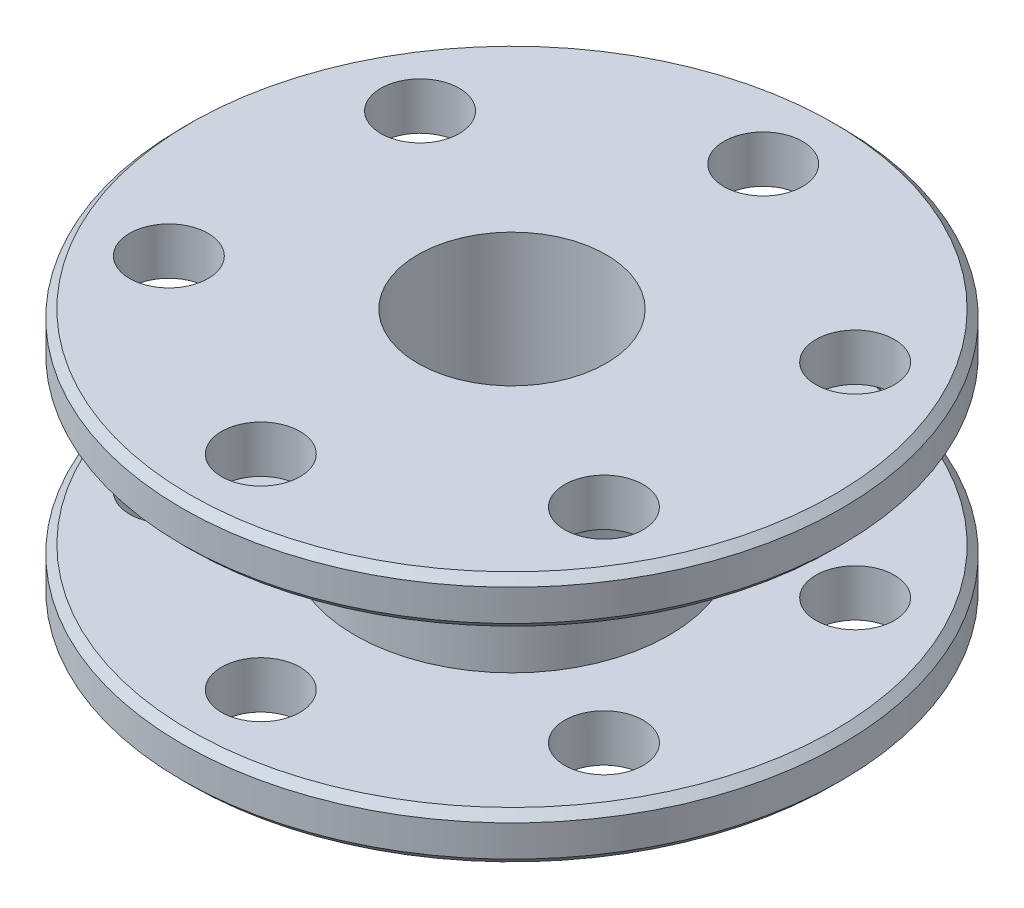
ISO-10303-21;
HEADER;
FILE_DESCRIPTION(('STEP AP214'),'2;1');
FILE_NAME('part.step','',(''),(''),'','','');
FILE_SCHEMA(('AUTOMOTIVE_DESIGN { 1 0 10303 214 1 1 1 1 }'));
ENDSEC;
DATA;
#1=APPLICATION_CONTEXT('core data for automotive mechanical design processes');
#2=APPLICATION_PROTOCOL_DEFINITION('international standard','automotive_design',2000,#1);
#3=PRODUCT_CONTEXT('',#1,'mechanical');
#4=PRODUCT('Part','Part','',(#3));
#5=PRODUCT_RELATED_PRODUCT_CATEGORY('part','',(#4));
#6=PRODUCT_DEFINITION_FORMATION('','',#4);
#7=PRODUCT_DEFINITION_CONTEXT('part definition',#1,'design');
#8=PRODUCT_DEFINITION('design','',#6,#7);
#9=PRODUCT_DEFINITION_SHAPE('','',#8);
#10=(LENGTH_UNIT() NAMED_UNIT(*) SI_UNIT(.MILLI.,.METRE.));
#11=(NAMED_UNIT(*) PLANE_ANGLE_UNIT() SI_UNIT($,.RADIAN.));
#12=(NAMED_UNIT(*) SI_UNIT($,.STERADIAN.) SOLID_ANGLE_UNIT());
#13=UNCERTAINTY_MEASURE_WITH_UNIT(LENGTH_MEASURE(1.E-05),#10,'distance_accuracy_value','');
#14=(GEOMETRIC_REPRESENTATION_CONTEXT(3) GLOBAL_UNCERTAINTY_ASSIGNED_CONTEXT((#13)) GLOBAL_UNIT_ASSIGNED_CONTEXT((#10,
#11,#12)) REPRESENTATION_CONTEXT('',''));
#15=CARTESIAN_POINT('',(0.,0.,0.));
#16=DIRECTION('',(0.,0.,1.));
#17=DIRECTION('',(1.,0.,0.));
#18=AXIS2_PLACEMENT_3D('',#15,#16,#17);
#19=CARTESIAN_POINT('',(0.,16.,0.));
#20=DIRECTION('',(0.,-1.,0.));
#21=DIRECTION('',(0.,0.,-1.));
#22=AXIS2_PLACEMENT_3D('',#19,#20,#21);
#23=CYLINDRICAL_SURFACE('',#22,21.);
#24=CARTESIAN_POINT('',(0.,0.499999999999994,0.));
#25=DIRECTION('',(0.,1.,0.));
#26=DIRECTION('',(0.,0.,1.));
#27=AXIS2_PLACEMENT_3D('',#24,#25,#26);
#28=CIRCLE('',#27,21.);
#29=CARTESIAN_POINT('',(0.,0.499999999999994,21.));
#30=VERTEX_POINT('',#29);
#31=EDGE_CURVE('E76',#30,#30,#28,.T.);
#32=ORIENTED_EDGE('',*,*,#31,.T.);
#33=EDGE_LOOP('',(#32));
#34=FACE_BOUND('',#33,.T.);
#35=CARTESIAN_POINT('',(0.,2.49999999999999,0.));
#36=DIRECTION('',(0.,-1.,0.));
#37=DIRECTION('',(0.,0.,-1.));
#38=AXIS2_PLACEMENT_3D('',#35,#36,#37);
#39=CIRCLE('',#38,21.);
#40=CARTESIAN_POINT('',(0.,2.49999999999999,-21.));
#41=VERTEX_POINT('',#40);
#42=EDGE_CURVE('E80',#41,#41,#39,.T.);
#43=ORIENTED_EDGE('',*,*,#42,.T.);
#44=EDGE_LOOP('',(#43));
#45=FACE_BOUND('',#44,.T.);
#46=ADVANCED_FACE('F43',(#34,#45),#23,.T.);
#47=CARTESIAN_POINT('',(0.,16.,-16.));
#48=DIRECTION('',(0.,-1.,0.));
#49=DIRECTION('',(0.,0.,-1.));
#50=AXIS2_PLACEMENT_3D('',#47,#48,#49);
#51=CYLINDRICAL_SURFACE('',#50,2.5);
#52=CARTESIAN_POINT('',(0.,3.,-16.));
#53=DIRECTION('',(0.,-1.,0.));
#54=DIRECTION('',(0.,0.,-1.));
#55=AXIS2_PLACEMENT_3D('',#52,#53,#54);
#56=CIRCLE('',#55,2.5);
#57=CARTESIAN_POINT('',(0.,3.,-18.5));
#58=VERTEX_POINT('',#57);
#59=EDGE_CURVE('E149',#58,#58,#56,.T.);
#60=ORIENTED_EDGE('',*,*,#59,.F.);
#61=EDGE_LOOP('',(#60));
#62=FACE_BOUND('',#61,.T.);
#63=CARTESIAN_POINT('',(0.,0.,-16.));
#64=DIRECTION('',(0.,1.,0.));
#65=DIRECTION('',(0.,0.,1.));
#66=AXIS2_PLACEMENT_3D('',#63,#64,#65);
#67=CIRCLE('',#66,2.5);
#68=CARTESIAN_POINT('',(0.,0.,-13.5));
#69=VERTEX_POINT('',#68);
#70=EDGE_CURVE('E105',#69,#69,#67,.T.);
#71=ORIENTED_EDGE('',*,*,#70,.F.);
#72=EDGE_LOOP('',(#71));
#73=FACE_BOUND('',#72,.T.);
#74=ADVANCED_FACE('F222',(#62,#73),#51,.F.);
#75=CARTESIAN_POINT('',(13.8564064605514,16.,-8.00000000000059));
#76=DIRECTION('',(0.,-1.,0.));
#77=DIRECTION('',(0.,0.,-1.));
#78=AXIS2_PLACEMENT_3D('',#75,#76,#77);
#79=CYLINDRICAL_SURFACE('',#78,2.50000000000019);
#80=CARTESIAN_POINT('',(13.8564064605514,3.,-8.00000000000059));
#81=DIRECTION('',(0.,-1.,0.));
#82=DIRECTION('',(0.,0.,-1.));
#83=AXIS2_PLACEMENT_3D('',#80,#81,#82);
#84=CIRCLE('',#83,2.50000000000019);
#85=CARTESIAN_POINT('',(13.8564064605514,3.,-10.5000000000008));
#86=VERTEX_POINT('',#85);
#87=EDGE_CURVE('E156',#86,#86,#84,.T.);
#88=ORIENTED_EDGE('',*,*,#87,.F.);
#89=EDGE_LOOP('',(#88));
#90=FACE_BOUND('',#89,.T.);
#91=CARTESIAN_POINT('',(13.8564064605514,0.,-8.00000000000059));
#92=DIRECTION('',(0.,1.,0.));
#93=DIRECTION('',(0.,0.,1.));
#94=AXIS2_PLACEMENT_3D('',#91,#92,#93);
#95=CIRCLE('',#94,2.50000000000019);
#96=CARTESIAN_POINT('',(13.8564064605514,0.,-5.5000000000004));
#97=VERTEX_POINT('',#96);
#98=EDGE_CURVE('E113',#97,#97,#95,.T.);
#99=ORIENTED_EDGE('',*,*,#98,.F.);
#100=EDGE_LOOP('',(#99));
#101=FACE_BOUND('',#100,.T.);
#102=ADVANCED_FACE('F265',(#90,#101),#79,.F.);
#103=CARTESIAN_POINT('',(13.856406460552,16.,7.99999999999941));
#104=DIRECTION('',(0.,-1.,0.));
#105=DIRECTION('',(0.,0.,-1.));
#106=AXIS2_PLACEMENT_3D('',#103,#104,#105);
#107=CYLINDRICAL_SURFACE('',#106,2.50000000000088);
#108=CARTESIAN_POINT('',(13.856406460552,3.,7.99999999999941));
#109=DIRECTION('',(0.,-1.,0.));
#110=DIRECTION('',(0.,0.,-1.));
#111=AXIS2_PLACEMENT_3D('',#108,#109,#110);
#112=CIRCLE('',#111,2.50000000000088);
#113=CARTESIAN_POINT('',(13.856406460552,3.,5.49999999999853));
#114=VERTEX_POINT('',#113);
#115=EDGE_CURVE('E160',#114,#114,#112,.T.);
#116=ORIENTED_EDGE('',*,*,#115,.F.);
#117=EDGE_LOOP('',(#116));
#118=FACE_BOUND('',#117,.T.);
#119=CARTESIAN_POINT('',(13.856406460552,0.,7.99999999999941));
#120=DIRECTION('',(0.,1.,0.));
#121=DIRECTION('',(0.,0.,1.));
#122=AXIS2_PLACEMENT_3D('',#119,#120,#121);
#123=CIRCLE('',#122,2.50000000000088);
#124=CARTESIAN_POINT('',(13.856406460552,0.,10.5000000000003));
#125=VERTEX_POINT('',#124);
#126=EDGE_CURVE('E121',#125,#125,#123,.T.);
#127=ORIENTED_EDGE('',*,*,#126,.F.);
#128=EDGE_LOOP('',(#127));
#129=FACE_BOUND('',#128,.T.);
#130=ADVANCED_FACE('F336',(#118,#129),#107,.F.);
#131=CARTESIAN_POINT('',(1.35836374802349E-12,16.,16.));
#132=DIRECTION('',(0.,-1.,0.));
#133=DIRECTION('',(0.,0.,-1.));
#134=AXIS2_PLACEMENT_3D('',#131,#132,#133);
#135=CYLINDRICAL_SURFACE('',#134,2.50000000000141);
#136=CARTESIAN_POINT('',(1.35836374802349E-12,3.,16.));
#137=DIRECTION('',(0.,-1.,0.));
#138=DIRECTION('',(0.,0.,-1.));
#139=AXIS2_PLACEMENT_3D('',#136,#137,#138);
#140=CIRCLE('',#139,2.50000000000141);
#141=CARTESIAN_POINT('',(1.35836374802349E-12,3.,13.4999999999986));
#142=VERTEX_POINT('',#141);
#143=EDGE_CURVE('E164',#142,#142,#140,.T.);
#144=ORIENTED_EDGE('',*,*,#143,.F.);
#145=EDGE_LOOP('',(#144));
#146=FACE_BOUND('',#145,.T.);
#147=CARTESIAN_POINT('',(1.35836374802349E-12,0.,16.));
#148=DIRECTION('',(0.,1.,0.));
#149=DIRECTION('',(0.,0.,1.));
#150=AXIS2_PLACEMENT_3D('',#147,#148,#149);
#151=CIRCLE('',#150,2.50000000000141);
#152=CARTESIAN_POINT('',(1.35836374802349E-12,0.,18.5000000000014));
#153=VERTEX_POINT('',#152);
#154=EDGE_CURVE('E129',#153,#153,#151,.T.);
#155=ORIENTED_EDGE('',*,*,#154,.F.);
#156=EDGE_LOOP('',(#155));
#157=FACE_BOUND('',#156,.T.);
#158=ADVANCED_FACE('F331',(#146,#157),#135,.F.);
#159=CARTESIAN_POINT('',(-13.85640646055,16.,8.0000000000006));
#160=DIRECTION('',(0.,-1.,0.));
#161=DIRECTION('',(0.,0.,-1.));
#162=AXIS2_PLACEMENT_3D('',#159,#160,#161);
#163=CYLINDRICAL_SURFACE('',#162,2.50000000000129);
#164=CARTESIAN_POINT('',(-13.85640646055,3.,8.0000000000006));
#165=DIRECTION('',(0.,-1.,0.));
#166=DIRECTION('',(0.,0.,-1.));
#167=AXIS2_PLACEMENT_3D('',#164,#165,#166);
#168=CIRCLE('',#167,2.50000000000129);
#169=CARTESIAN_POINT('',(-13.85640646055,3.,5.4999999999993));
#170=VERTEX_POINT('',#169);
#171=EDGE_CURVE('E89',#170,#170,#168,.T.);
#172=ORIENTED_EDGE('',*,*,#171,.F.);
#173=EDGE_LOOP('',(#172));
#174=FACE_BOUND('',#173,.T.);
#175=CARTESIAN_POINT('',(-13.85640646055,0.,8.0000000000006));
#176=DIRECTION('',(0.,1.,0.));
#177=DIRECTION('',(0.,0.,1.));
#178=AXIS2_PLACEMENT_3D('',#175,#176,#177);
#179=CIRCLE('',#178,2.50000000000129);
#180=CARTESIAN_POINT('',(-13.85640646055,0.,10.5000000000019));
#181=VERTEX_POINT('',#180);
#182=EDGE_CURVE('E137',#181,#181,#179,.T.);
#183=ORIENTED_EDGE('',*,*,#182,.F.);
#184=EDGE_LOOP('',(#183));
#185=FACE_BOUND('',#184,.T.);
#186=ADVANCED_FACE('F254',(#174,#185),#163,.F.);
#187=CARTESIAN_POINT('',(-13.8564064605507,16.,-7.9999999999994));
#188=DIRECTION('',(0.,-1.,0.));
#189=DIRECTION('',(0.,0.,-1.));
#190=AXIS2_PLACEMENT_3D('',#187,#188,#189);
#191=CYLINDRICAL_SURFACE('',#190,2.50000000000069);
#192=CARTESIAN_POINT('',(-13.8564064605507,3.,-7.9999999999994));
#193=DIRECTION('',(0.,-1.,0.));
#194=DIRECTION('',(0.,0.,-1.));
#195=AXIS2_PLACEMENT_3D('',#192,#193,#194);
#196=CIRCLE('',#195,2.50000000000069);
#197=CARTESIAN_POINT('',(-13.8564064605507,3.,-10.5000000000001));
#198=VERTEX_POINT('',#197);
#199=EDGE_CURVE('E85',#198,#198,#196,.T.);
#200=ORIENTED_EDGE('',*,*,#199,.F.);
#201=EDGE_LOOP('',(#200));
#202=FACE_BOUND('',#201,.T.);
#203=CARTESIAN_POINT('',(-13.8564064605507,0.,-7.9999999999994));
#204=DIRECTION('',(0.,1.,0.));
#205=DIRECTION('',(0.,0.,1.));
#206=AXIS2_PLACEMENT_3D('',#203,#204,#205);
#207=CIRCLE('',#206,2.50000000000069);
#208=CARTESIAN_POINT('',(-13.8564064605507,0.,-5.49999999999872));
#209=VERTEX_POINT('',#208);
#210=EDGE_CURVE('E145',#209,#209,#207,.T.);
#211=ORIENTED_EDGE('',*,*,#210,.F.);
#212=EDGE_LOOP('',(#211));
#213=FACE_BOUND('',#212,.T.);
#214=ADVANCED_FACE('F229',(#202,#213),#191,.F.);
#215=CARTESIAN_POINT('',(0.,16.,0.));
#216=DIRECTION('',(0.,1.,0.));
#217=DIRECTION('',(0.,0.,1.));
#218=AXIS2_PLACEMENT_3D('',#215,#216,#217);
#219=PLANE('',#218);
#220=CARTESIAN_POINT('',(0.,16.,0.));
#221=DIRECTION('',(0.,1.,0.));
#222=DIRECTION('',(0.,0.,1.));
#223=AXIS2_PLACEMENT_3D('',#220,#221,#222);
#224=CIRCLE('',#223,20.5);
#225=CARTESIAN_POINT('',(0.,16.,20.5));
#226=VERTEX_POINT('',#225);
#227=EDGE_CURVE('E62',#226,#226,#224,.T.);
#228=ORIENTED_EDGE('',*,*,#227,.T.);
#229=EDGE_LOOP('',(#228));
#230=FACE_BOUND('',#229,.T.);
#231=CARTESIAN_POINT('',(-13.85640646055,16.,8.0000000000006));
#232=DIRECTION('',(0.,1.,0.));
#233=DIRECTION('',(0.,0.,1.));
#234=AXIS2_PLACEMENT_3D('',#231,#232,#233);
#235=CIRCLE('',#234,2.50000000000129);
#236=CARTESIAN_POINT('',(-13.85640646055,16.,10.5000000000019));
#237=VERTEX_POINT('',#236);
#238=EDGE_CURVE('E133',#237,#237,#235,.T.);
#239=ORIENTED_EDGE('',*,*,#238,.F.);
#240=EDGE_LOOP('',(#239));
#241=FACE_BOUND('',#240,.T.);
#242=CARTESIAN_POINT('',(13.856406460552,16.,7.99999999999941));
#243=DIRECTION('',(0.,1.,0.));
#244=DIRECTION('',(0.,0.,1.));
#245=AXIS2_PLACEMENT_3D('',#242,#243,#244);
#246=CIRCLE('',#245,2.50000000000088);
#247=CARTESIAN_POINT('',(13.856406460552,16.,10.5000000000003));
#248=VERTEX_POINT('',#247);
#249=EDGE_CURVE('E117',#248,#248,#246,.T.);
#250=ORIENTED_EDGE('',*,*,#249,.F.);
#251=EDGE_LOOP('',(#250));
#252=FACE_BOUND('',#251,.T.);
#253=CARTESIAN_POINT('',(0.,16.,-16.));
#254=DIRECTION('',(0.,1.,0.));
#255=DIRECTION('',(0.,0.,1.));
#256=AXIS2_PLACEMENT_3D('',#253,#254,#255);
#257=CIRCLE('',#256,2.5);
#258=CARTESIAN_POINT('',(0.,16.,-13.5));
#259=VERTEX_POINT('',#258);
#260=EDGE_CURVE('E101',#259,#259,#257,.T.);
#261=ORIENTED_EDGE('',*,*,#260,.F.);
#262=EDGE_LOOP('',(#261));
#263=FACE_BOUND('',#262,.T.);
#264=CARTESIAN_POINT('',(0.,16.,0.));
#265=DIRECTION('',(0.,1.,0.));
#266=DIRECTION('',(0.,0.,1.));
#267=AXIS2_PLACEMENT_3D('',#264,#265,#266);
#268=CIRCLE('',#267,6.);
#269=CARTESIAN_POINT('',(0.,16.,6.));
#270=VERTEX_POINT('',#269);
#271=EDGE_CURVE('E84',#270,#270,#268,.T.);
#272=ORIENTED_EDGE('',*,*,#271,.F.);
#273=EDGE_LOOP('',(#272));
#274=FACE_BOUND('',#273,.T.);
#275=CARTESIAN_POINT('',(13.8564064605514,16.,-8.00000000000059));
#276=DIRECTION('',(0.,1.,0.));
#277=DIRECTION('',(0.,0.,1.));
#278=AXIS2_PLACEMENT_3D('',#275,#276,#277);
#279=CIRCLE('',#278,2.50000000000019);
#280=CARTESIAN_POINT('',(13.8564064605514,16.,-5.5000000000004));
#281=VERTEX_POINT('',#280);
#282=EDGE_CURVE('E109',#281,#281,#279,.T.);
#283=ORIENTED_EDGE('',*,*,#282,.F.);
#284=EDGE_LOOP('',(#283));
#285=FACE_BOUND('',#284,.T.);
#286=CARTESIAN_POINT('',(1.35836374802349E-12,16.,16.));
#287=DIRECTION('',(0.,1.,0.));
#288=DIRECTION('',(0.,0.,1.));
#289=AXIS2_PLACEMENT_3D('',#286,#287,#288);
#290=CIRCLE('',#289,2.50000000000141);
#291=CARTESIAN_POINT('',(1.35836374802349E-12,16.,18.5000000000014));
#292=VERTEX_POINT('',#291);
#293=EDGE_CURVE('E125',#292,#292,#290,.T.);
#294=ORIENTED_EDGE('',*,*,#293,.F.);
#295=EDGE_LOOP('',(#294));
#296=FACE_BOUND('',#295,.T.);
#297=CARTESIAN_POINT('',(-13.8564064605507,16.,-7.9999999999994));
#298=DIRECTION('',(0.,1.,0.));
#299=DIRECTION('',(0.,0.,1.));
#300=AXIS2_PLACEMENT_3D('',#297,#298,#299);
#301=CIRCLE('',#300,2.50000000000069);
#302=CARTESIAN_POINT('',(-13.8564064605507,16.,-5.49999999999872));
#303=VERTEX_POINT('',#302);
#304=EDGE_CURVE('E141',#303,#303,#301,.T.);
#305=ORIENTED_EDGE('',*,*,#304,.F.);
#306=EDGE_LOOP('',(#305));
#307=FACE_BOUND('',#306,.T.);
#308=ADVANCED_FACE('F225',(#230,#241,#252,#263,#274,#285,#296,#307),#219,.T.);
#309=CARTESIAN_POINT('',(0.,0.,0.));
#310=DIRECTION('',(0.,1.,0.));
#311=DIRECTION('',(0.,0.,1.));
#312=AXIS2_PLACEMENT_3D('',#309,#310,#311);
#313=PLANE('',#312);
#314=CARTESIAN_POINT('',(0.,0.,0.));
#315=DIRECTION('',(0.,1.,0.));
#316=DIRECTION('',(0.,0.,1.));
#317=AXIS2_PLACEMENT_3D('',#314,#315,#316);
#318=CIRCLE('',#317,20.5);
#319=CARTESIAN_POINT('',(0.,0.,20.5));
#320=VERTEX_POINT('',#319);
#321=EDGE_CURVE('E72',#320,#320,#318,.F.);
#322=ORIENTED_EDGE('',*,*,#321,.T.);
#323=EDGE_LOOP('',(#322));
#324=FACE_BOUND('',#323,.T.);
#325=CARTESIAN_POINT('',(0.,0.,0.));
#326=DIRECTION('',(0.,1.,0.));
#327=DIRECTION('',(0.,0.,1.));
#328=AXIS2_PLACEMENT_3D('',#325,#326,#327);
#329=CIRCLE('',#328,6.);
#330=CARTESIAN_POINT('',(0.,0.,6.));
#331=VERTEX_POINT('',#330);
#332=EDGE_CURVE('E97',#331,#331,#329,.T.);
#333=ORIENTED_EDGE('',*,*,#332,.T.);
#334=EDGE_LOOP('',(#333));
#335=FACE_BOUND('',#334,.T.);
#336=ORIENTED_EDGE('',*,*,#70,.T.);
#337=EDGE_LOOP('',(#336));
#338=FACE_BOUND('',#337,.T.);
#339=ORIENTED_EDGE('',*,*,#98,.T.);
#340=EDGE_LOOP('',(#339));
#341=FACE_BOUND('',#340,.T.);
#342=ORIENTED_EDGE('',*,*,#126,.T.);
#343=EDGE_LOOP('',(#342));
#344=FACE_BOUND('',#343,.T.);
#345=ORIENTED_EDGE('',*,*,#154,.T.);
#346=EDGE_LOOP('',(#345));
#347=FACE_BOUND('',#346,.T.);
#348=ORIENTED_EDGE('',*,*,#182,.T.);
#349=EDGE_LOOP('',(#348));
#350=FACE_BOUND('',#349,.T.);
#351=ORIENTED_EDGE('',*,*,#210,.T.);
#352=EDGE_LOOP('',(#351));
#353=FACE_BOUND('',#352,.T.);
#354=ADVANCED_FACE('F228',(#324,#335,#338,#341,#344,#347,#350,#353),#313,.F.);
#355=CARTESIAN_POINT('',(0.,15.5,0.));
#356=DIRECTION('',(0.,1.,0.));
#357=DIRECTION('',(0.,0.,1.));
#358=AXIS2_PLACEMENT_3D('',#355,#356,#357);
#359=CIRCLE('',#358,21.);
#360=CARTESIAN_POINT('',(0.,15.5,21.));
#361=VERTEX_POINT('',#360);
#362=EDGE_CURVE('E52',#361,#361,#359,.F.);
#363=ORIENTED_EDGE('',*,*,#362,.T.);
#364=EDGE_LOOP('',(#363));
#365=FACE_BOUND('',#364,.T.);
#366=CARTESIAN_POINT('',(0.,13.5,0.));
#367=DIRECTION('',(0.,1.,0.));
#368=DIRECTION('',(0.,0.,1.));
#369=AXIS2_PLACEMENT_3D('',#366,#367,#368);
#370=CIRCLE('',#369,21.);
#371=CARTESIAN_POINT('',(0.,13.5,21.));
#372=VERTEX_POINT('',#371);
#373=EDGE_CURVE('E57',#372,#372,#370,.T.);
#374=ORIENTED_EDGE('',*,*,#373,.T.);
#375=EDGE_LOOP('',(#374));
#376=FACE_BOUND('',#375,.T.);
#377=ADVANCED_FACE('F261',(#365,#376),#23,.T.);
#378=CARTESIAN_POINT('',(0.,16.,0.));
#379=DIRECTION('',(0.,-1.,0.));
#380=DIRECTION('',(0.,0.,-1.));
#381=AXIS2_PLACEMENT_3D('',#378,#379,#380);
#382=CYLINDRICAL_SURFACE('',#381,6.);
#383=ORIENTED_EDGE('',*,*,#271,.T.);
#384=EDGE_LOOP('',(#383));
#385=FACE_BOUND('',#384,.T.);
#386=ORIENTED_EDGE('',*,*,#332,.F.);
#387=EDGE_LOOP('',(#386));
#388=FACE_BOUND('',#387,.T.);
#389=ADVANCED_FACE('F220',(#385,#388),#382,.F.);
#390=CARTESIAN_POINT('',(0.,13.,-16.));
#391=DIRECTION('',(0.,1.,0.));
#392=DIRECTION('',(0.,0.,1.));
#393=AXIS2_PLACEMENT_3D('',#390,#391,#392);
#394=CIRCLE('',#393,2.5);
#395=CARTESIAN_POINT('',(0.,13.,-13.5));
#396=VERTEX_POINT('',#395);
#397=EDGE_CURVE('E90',#396,#396,#394,.T.);
#398=ORIENTED_EDGE('',*,*,#397,.F.);
#399=EDGE_LOOP('',(#398));
#400=FACE_BOUND('',#399,.T.);
#401=ORIENTED_EDGE('',*,*,#260,.T.);
#402=EDGE_LOOP('',(#401));
#403=FACE_BOUND('',#402,.T.);
#404=ADVANCED_FACE('F216',(#400,#403),#51,.F.);
#405=CARTESIAN_POINT('',(13.8564064605514,13.,-8.00000000000059));
#406=DIRECTION('',(0.,1.,0.));
#407=DIRECTION('',(0.,0.,1.));
#408=AXIS2_PLACEMENT_3D('',#405,#406,#407);
#409=CIRCLE('',#408,2.50000000000019);
#410=CARTESIAN_POINT('',(13.8564064605514,13.,-5.5000000000004));
#411=VERTEX_POINT('',#410);
#412=EDGE_CURVE('E174',#411,#411,#409,.T.);
#413=ORIENTED_EDGE('',*,*,#412,.F.);
#414=EDGE_LOOP('',(#413));
#415=FACE_BOUND('',#414,.T.);
#416=ORIENTED_EDGE('',*,*,#282,.T.);
#417=EDGE_LOOP('',(#416));
#418=FACE_BOUND('',#417,.T.);
#419=ADVANCED_FACE('F219',(#415,#418),#79,.F.);
#420=CARTESIAN_POINT('',(13.856406460552,13.,7.99999999999941));
#421=DIRECTION('',(0.,1.,0.));
#422=DIRECTION('',(0.,0.,1.));
#423=AXIS2_PLACEMENT_3D('',#420,#421,#422);
#424=CIRCLE('',#423,2.50000000000088);
#425=CARTESIAN_POINT('',(13.856406460552,13.,10.5000000000003));
#426=VERTEX_POINT('',#425);
#427=EDGE_CURVE('E178',#426,#426,#424,.T.);
#428=ORIENTED_EDGE('',*,*,#427,.F.);
#429=EDGE_LOOP('',(#428));
#430=FACE_BOUND('',#429,.T.);
#431=ORIENTED_EDGE('',*,*,#249,.T.);
#432=EDGE_LOOP('',(#431));
#433=FACE_BOUND('',#432,.T.);
#434=ADVANCED_FACE('F342',(#430,#433),#107,.F.);
#435=CARTESIAN_POINT('',(1.35836374802349E-12,13.,16.));
#436=DIRECTION('',(0.,1.,0.));
#437=DIRECTION('',(0.,0.,1.));
#438=AXIS2_PLACEMENT_3D('',#435,#436,#437);
#439=CIRCLE('',#438,2.50000000000141);
#440=CARTESIAN_POINT('',(1.35836374802349E-12,13.,18.5000000000014));
#441=VERTEX_POINT('',#440);
#442=EDGE_CURVE('E182',#441,#441,#439,.T.);
#443=ORIENTED_EDGE('',*,*,#442,.F.);
#444=EDGE_LOOP('',(#443));
#445=FACE_BOUND('',#444,.T.);
#446=ORIENTED_EDGE('',*,*,#293,.T.);
#447=EDGE_LOOP('',(#446));
#448=FACE_BOUND('',#447,.T.);
#449=ADVANCED_FACE('F251',(#445,#448),#135,.F.);
#450=CARTESIAN_POINT('',(-13.85640646055,13.,8.0000000000006));
#451=DIRECTION('',(0.,1.,0.));
#452=DIRECTION('',(0.,0.,1.));
#453=AXIS2_PLACEMENT_3D('',#450,#451,#452);
#454=CIRCLE('',#453,2.50000000000129);
#455=CARTESIAN_POINT('',(-13.85640646055,13.,10.5000000000019));
#456=VERTEX_POINT('',#455);
#457=EDGE_CURVE('E95',#456,#456,#454,.T.);
#458=ORIENTED_EDGE('',*,*,#457,.F.);
#459=EDGE_LOOP('',(#458));
#460=FACE_BOUND('',#459,.T.);
#461=ORIENTED_EDGE('',*,*,#238,.T.);
#462=EDGE_LOOP('',(#461));
#463=FACE_BOUND('',#462,.T.);
#464=ADVANCED_FACE('F242',(#460,#463),#163,.F.);
#465=CARTESIAN_POINT('',(-13.8564064605507,13.,-7.9999999999994));
#466=DIRECTION('',(0.,1.,0.));
#467=DIRECTION('',(0.,0.,1.));
#468=AXIS2_PLACEMENT_3D('',#465,#466,#467);
#469=CIRCLE('',#468,2.50000000000069);
#470=CARTESIAN_POINT('',(-13.8564064605507,13.,-5.49999999999872));
#471=VERTEX_POINT('',#470);
#472=EDGE_CURVE('E91',#471,#471,#469,.T.);
#473=ORIENTED_EDGE('',*,*,#472,.F.);
#474=EDGE_LOOP('',(#473));
#475=FACE_BOUND('',#474,.T.);
#476=ORIENTED_EDGE('',*,*,#304,.T.);
#477=EDGE_LOOP('',(#476));
#478=FACE_BOUND('',#477,.T.);
#479=ADVANCED_FACE('F240',(#475,#478),#191,.F.);
#480=CARTESIAN_POINT('',(0.,3.,-10.));
#481=DIRECTION('',(0.,-1.,0.));
#482=DIRECTION('',(0.,0.,-1.));
#483=AXIS2_PLACEMENT_3D('',#480,#481,#482);
#484=PLANE('',#483);
#485=CARTESIAN_POINT('',(0.,3.,0.));
#486=DIRECTION('',(0.,-1.,0.));
#487=DIRECTION('',(0.,0.,-1.));
#488=AXIS2_PLACEMENT_3D('',#485,#486,#487);
#489=CIRCLE('',#488,20.5);
#490=CARTESIAN_POINT('',(0.,3.,-20.5));
#491=VERTEX_POINT('',#490);
#492=EDGE_CURVE('E68',#491,#491,#489,.F.);
#493=ORIENTED_EDGE('',*,*,#492,.T.);
#494=EDGE_LOOP('',(#493));
#495=FACE_BOUND('',#494,.T.);
#496=CARTESIAN_POINT('',(0.,3.,0.));
#497=DIRECTION('',(0.,-1.,0.));
#498=DIRECTION('',(0.,0.,-1.));
#499=AXIS2_PLACEMENT_3D('',#496,#497,#498);
#500=CIRCLE('',#499,10.);
#501=CARTESIAN_POINT('',(0.,3.,-10.));
#502=VERTEX_POINT('',#501);
#503=EDGE_CURVE('E96',#502,#502,#500,.T.);
#504=ORIENTED_EDGE('',*,*,#503,.T.);
#505=EDGE_LOOP('',(#504));
#506=FACE_BOUND('',#505,.T.);
#507=ORIENTED_EDGE('',*,*,#199,.T.);
#508=EDGE_LOOP('',(#507));
#509=FACE_BOUND('',#508,.T.);
#510=ORIENTED_EDGE('',*,*,#171,.T.);
#511=EDGE_LOOP('',(#510));
#512=FACE_BOUND('',#511,.T.);
#513=ORIENTED_EDGE('',*,*,#143,.T.);
#514=EDGE_LOOP('',(#513));
#515=FACE_BOUND('',#514,.T.);
#516=ORIENTED_EDGE('',*,*,#115,.T.);
#517=EDGE_LOOP('',(#516));
#518=FACE_BOUND('',#517,.T.);
#519=ORIENTED_EDGE('',*,*,#87,.T.);
#520=EDGE_LOOP('',(#519));
#521=FACE_BOUND('',#520,.T.);
#522=ORIENTED_EDGE('',*,*,#59,.T.);
#523=EDGE_LOOP('',(#522));
#524=FACE_BOUND('',#523,.T.);
#525=ADVANCED_FACE('F202',(#495,#506,#509,#512,#515,#518,#521,#524),#484,.F.);
#526=CARTESIAN_POINT('',(0.,13.,-10.));
#527=DIRECTION('',(0.,1.,0.));
#528=DIRECTION('',(0.,0.,1.));
#529=AXIS2_PLACEMENT_3D('',#526,#527,#528);
#530=PLANE('',#529);
#531=CARTESIAN_POINT('',(0.,13.,0.));
#532=DIRECTION('',(0.,1.,0.));
#533=DIRECTION('',(0.,0.,1.));
#534=AXIS2_PLACEMENT_3D('',#531,#532,#533);
#535=CIRCLE('',#534,20.5);
#536=CARTESIAN_POINT('',(0.,13.,20.5));
#537=VERTEX_POINT('',#536);
#538=EDGE_CURVE('E10',#537,#537,#535,.F.);
#539=ORIENTED_EDGE('',*,*,#538,.T.);
#540=EDGE_LOOP('',(#539));
#541=FACE_BOUND('',#540,.T.);
#542=CARTESIAN_POINT('',(0.,13.,0.));
#543=DIRECTION('',(0.,-1.,0.));
#544=DIRECTION('',(0.,0.,-1.));
#545=AXIS2_PLACEMENT_3D('',#542,#543,#544);
#546=CIRCLE('',#545,10.);
#547=CARTESIAN_POINT('',(0.,13.,-10.));
#548=VERTEX_POINT('',#547);
#549=EDGE_CURVE('E192',#548,#548,#546,.T.);
#550=ORIENTED_EDGE('',*,*,#549,.F.);
#551=EDGE_LOOP('',(#550));
#552=FACE_BOUND('',#551,.T.);
#553=ORIENTED_EDGE('',*,*,#472,.T.);
#554=EDGE_LOOP('',(#553));
#555=FACE_BOUND('',#554,.T.);
#556=ORIENTED_EDGE('',*,*,#457,.T.);
#557=EDGE_LOOP('',(#556));
#558=FACE_BOUND('',#557,.T.);
#559=ORIENTED_EDGE('',*,*,#442,.T.);
#560=EDGE_LOOP('',(#559));
#561=FACE_BOUND('',#560,.T.);
#562=ORIENTED_EDGE('',*,*,#427,.T.);
#563=EDGE_LOOP('',(#562));
#564=FACE_BOUND('',#563,.T.);
#565=ORIENTED_EDGE('',*,*,#412,.T.);
#566=EDGE_LOOP('',(#565));
#567=FACE_BOUND('',#566,.T.);
#568=ORIENTED_EDGE('',*,*,#397,.T.);
#569=EDGE_LOOP('',(#568));
#570=FACE_BOUND('',#569,.T.);
#571=ADVANCED_FACE('F199',(#541,#552,#555,#558,#561,#564,#567,#570),#530,.F.);
#572=CARTESIAN_POINT('',(0.,0.,0.));
#573=DIRECTION('',(0.,-1.,0.));
#574=DIRECTION('',(0.,0.,-1.));
#575=AXIS2_PLACEMENT_3D('',#572,#573,#574);
#576=CYLINDRICAL_SURFACE('',#575,10.);
#577=ORIENTED_EDGE('',*,*,#503,.F.);
#578=EDGE_LOOP('',(#577));
#579=FACE_BOUND('',#578,.T.);
#580=ORIENTED_EDGE('',*,*,#549,.T.);
#581=EDGE_LOOP('',(#580));
#582=FACE_BOUND('',#581,.T.);
#583=ADVANCED_FACE('F197',(#579,#582),#576,.T.);
#584=CARTESIAN_POINT('',(0.,0.499999999999994,0.));
#585=DIRECTION('',(0.,1.,0.));
#586=DIRECTION('',(0.,0.,1.));
#587=AXIS2_PLACEMENT_3D('',#584,#585,#586);
#588=CONICAL_SURFACE('',#587,21.,0.785398163397448);
#589=ORIENTED_EDGE('',*,*,#321,.F.);
#590=EDGE_LOOP('',(#589));
#591=FACE_BOUND('',#590,.T.);
#592=ORIENTED_EDGE('',*,*,#31,.F.);
#593=EDGE_LOOP('',(#592));
#594=FACE_BOUND('',#593,.T.);
#595=ADVANCED_FACE('F292',(#591,#594),#588,.T.);
#596=CARTESIAN_POINT('',(0.,2.49999999999999,0.));
#597=DIRECTION('',(0.,-1.,0.));
#598=DIRECTION('',(0.,0.,-1.));
#599=AXIS2_PLACEMENT_3D('',#596,#597,#598);
#600=CONICAL_SURFACE('',#599,21.,0.785398163397448);
#601=ORIENTED_EDGE('',*,*,#492,.F.);
#602=EDGE_LOOP('',(#601));
#603=FACE_BOUND('',#602,.T.);
#604=ORIENTED_EDGE('',*,*,#42,.F.);
#605=EDGE_LOOP('',(#604));
#606=FACE_BOUND('',#605,.T.);
#607=ADVANCED_FACE('F287',(#603,#606),#600,.T.);
#608=CARTESIAN_POINT('',(0.,16.,0.));
#609=DIRECTION('',(0.,-1.,0.));
#610=DIRECTION('',(0.,0.,-1.));
#611=AXIS2_PLACEMENT_3D('',#608,#609,#610);
#612=CONICAL_SURFACE('',#611,20.5,0.785398163397448);
#613=ORIENTED_EDGE('',*,*,#362,.F.);
#614=EDGE_LOOP('',(#613));
#615=FACE_BOUND('',#614,.T.);
#616=ORIENTED_EDGE('',*,*,#227,.F.);
#617=EDGE_LOOP('',(#616));
#618=FACE_BOUND('',#617,.T.);
#619=ADVANCED_FACE('F282',(#615,#618),#612,.T.);
#620=CARTESIAN_POINT('',(0.,13.5,0.));
#621=DIRECTION('',(0.,1.,0.));
#622=DIRECTION('',(0.,0.,1.));
#623=AXIS2_PLACEMENT_3D('',#620,#621,#622);
#624=CONICAL_SURFACE('',#623,21.,0.785398163397448);
#625=ORIENTED_EDGE('',*,*,#538,.F.);
#626=EDGE_LOOP('',(#625));
#627=FACE_BOUND('',#626,.T.);
#628=ORIENTED_EDGE('',*,*,#373,.F.);
#629=EDGE_LOOP('',(#628));
#630=FACE_BOUND('',#629,.T.);
#631=ADVANCED_FACE('F46',(#627,#630),#624,.T.);
#632=CLOSED_SHELL('',(#46,#74,#102,#130,#158,#186,#214,#308,#354,#377,#389,#404,#419,#434,#449,
#464,#479,#525,#571,#583,#595,#607,#619,#631));
#633=MANIFOLD_SOLID_BREP('B2',#632);
#634=ADVANCED_BREP_SHAPE_REPRESENTATION('',(#18,#633),#14);
#635=SHAPE_DEFINITION_REPRESENTATION(#9,#634);
ENDSEC;
END-ISO-10303-21;
